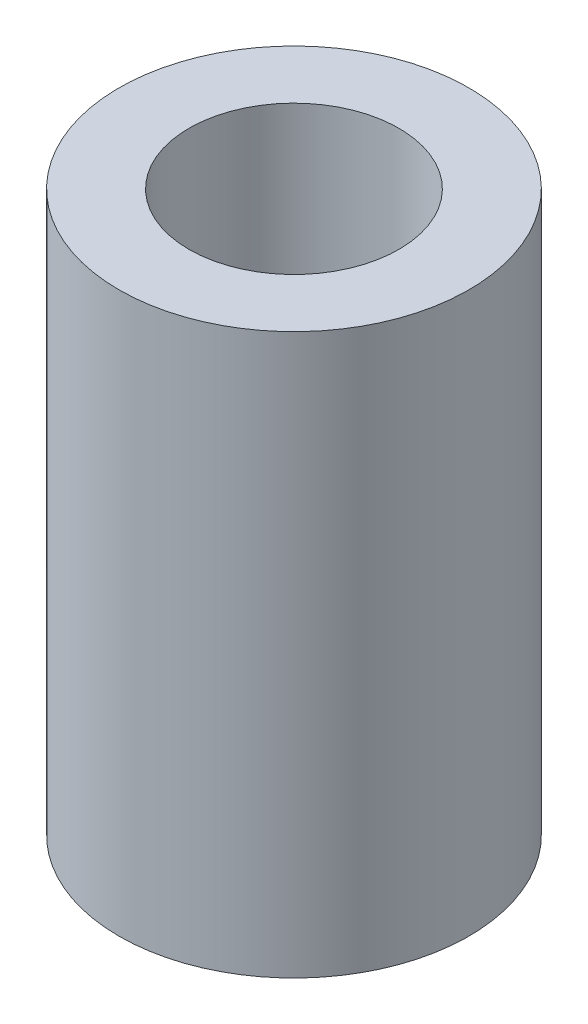
ISO-10303-21;
HEADER;
FILE_DESCRIPTION(('STEP AP214'),'2;1');
FILE_NAME('part.step','',(''),(''),'','','');
FILE_SCHEMA(('AUTOMOTIVE_DESIGN { 1 0 10303 214 1 1 1 1 }'));
ENDSEC;
DATA;
#1=APPLICATION_CONTEXT('core data for automotive mechanical design processes');
#2=APPLICATION_PROTOCOL_DEFINITION('international standard','automotive_design',2000,#1);
#3=PRODUCT_CONTEXT('',#1,'mechanical');
#4=PRODUCT('Part','Part','',(#3));
#5=PRODUCT_RELATED_PRODUCT_CATEGORY('part','',(#4));
#6=PRODUCT_DEFINITION_FORMATION('','',#4);
#7=PRODUCT_DEFINITION_CONTEXT('part definition',#1,'design');
#8=PRODUCT_DEFINITION('design','',#6,#7);
#9=PRODUCT_DEFINITION_SHAPE('','',#8);
#10=(LENGTH_UNIT() NAMED_UNIT(*) SI_UNIT(.MILLI.,.METRE.));
#11=(NAMED_UNIT(*) PLANE_ANGLE_UNIT() SI_UNIT($,.RADIAN.));
#12=(NAMED_UNIT(*) SI_UNIT($,.STERADIAN.) SOLID_ANGLE_UNIT());
#13=UNCERTAINTY_MEASURE_WITH_UNIT(LENGTH_MEASURE(1.E-05),#10,'distance_accuracy_value','');
#14=(GEOMETRIC_REPRESENTATION_CONTEXT(3) GLOBAL_UNCERTAINTY_ASSIGNED_CONTEXT((#13)) GLOBAL_UNIT_ASSIGNED_CONTEXT((#10,
#11,#12)) REPRESENTATION_CONTEXT('',''));
#15=CARTESIAN_POINT('',(0.,0.,0.));
#16=DIRECTION('',(0.,0.,1.));
#17=DIRECTION('',(1.,0.,0.));
#18=AXIS2_PLACEMENT_3D('',#15,#16,#17);
#19=CARTESIAN_POINT('',(0.,8.,0.));
#20=DIRECTION('',(0.,1.,0.));
#21=DIRECTION('',(0.,0.,1.));
#22=AXIS2_PLACEMENT_3D('',#19,#20,#21);
#23=PLANE('',#22);
#24=CARTESIAN_POINT('',(0.,8.,0.));
#25=DIRECTION('',(0.,1.,0.));
#26=DIRECTION('',(0.,0.,1.));
#27=AXIS2_PLACEMENT_3D('',#24,#25,#26);
#28=CIRCLE('',#27,2.5);
#29=CARTESIAN_POINT('',(0.,8.,2.5));
#30=VERTEX_POINT('',#29);
#31=EDGE_CURVE('E10',#30,#30,#28,.T.);
#32=ORIENTED_EDGE('',*,*,#31,.T.);
#33=EDGE_LOOP('',(#32));
#34=FACE_BOUND('',#33,.T.);
#35=CARTESIAN_POINT('',(0.,8.,0.));
#36=DIRECTION('',(0.,1.,0.));
#37=DIRECTION('',(0.,0.,1.));
#38=AXIS2_PLACEMENT_3D('',#35,#36,#37);
#39=CIRCLE('',#38,1.5);
#40=CARTESIAN_POINT('',(0.,8.,1.5));
#41=VERTEX_POINT('',#40);
#42=EDGE_CURVE('E49',#41,#41,#39,.T.);
#43=ORIENTED_EDGE('',*,*,#42,.F.);
#44=EDGE_LOOP('',(#43));
#45=FACE_BOUND('',#44,.T.);
#46=ADVANCED_FACE('F39',(#34,#45),#23,.T.);
#47=CARTESIAN_POINT('',(0.,0.,0.));
#48=DIRECTION('',(0.,1.,0.));
#49=DIRECTION('',(0.,0.,1.));
#50=AXIS2_PLACEMENT_3D('',#47,#48,#49);
#51=PLANE('',#50);
#52=CARTESIAN_POINT('',(0.,0.,0.));
#53=DIRECTION('',(0.,1.,0.));
#54=DIRECTION('',(0.,0.,1.));
#55=AXIS2_PLACEMENT_3D('',#52,#53,#54);
#56=CIRCLE('',#55,2.5);
#57=CARTESIAN_POINT('',(0.,0.,2.5));
#58=VERTEX_POINT('',#57);
#59=EDGE_CURVE('E43',#58,#58,#56,.T.);
#60=ORIENTED_EDGE('',*,*,#59,.F.);
#61=EDGE_LOOP('',(#60));
#62=FACE_BOUND('',#61,.T.);
#63=CARTESIAN_POINT('',(0.,0.,0.));
#64=DIRECTION('',(0.,1.,0.));
#65=DIRECTION('',(0.,0.,1.));
#66=AXIS2_PLACEMENT_3D('',#63,#64,#65);
#67=CIRCLE('',#66,1.5);
#68=CARTESIAN_POINT('',(0.,0.,1.5));
#69=VERTEX_POINT('',#68);
#70=EDGE_CURVE('E55',#69,#69,#67,.T.);
#71=ORIENTED_EDGE('',*,*,#70,.T.);
#72=EDGE_LOOP('',(#71));
#73=FACE_BOUND('',#72,.T.);
#74=ADVANCED_FACE('F62',(#62,#73),#51,.F.);
#75=CARTESIAN_POINT('',(0.,8.,0.));
#76=DIRECTION('',(0.,-1.,0.));
#77=DIRECTION('',(0.,0.,-1.));
#78=AXIS2_PLACEMENT_3D('',#75,#76,#77);
#79=CYLINDRICAL_SURFACE('',#78,2.5);
#80=ORIENTED_EDGE('',*,*,#31,.F.);
#81=EDGE_LOOP('',(#80));
#82=FACE_BOUND('',#81,.T.);
#83=ORIENTED_EDGE('',*,*,#59,.T.);
#84=EDGE_LOOP('',(#83));
#85=FACE_BOUND('',#84,.T.);
#86=ADVANCED_FACE('F41',(#82,#85),#79,.T.);
#87=CARTESIAN_POINT('',(0.,8.,0.));
#88=DIRECTION('',(0.,-1.,0.));
#89=DIRECTION('',(0.,0.,-1.));
#90=AXIS2_PLACEMENT_3D('',#87,#88,#89);
#91=CYLINDRICAL_SURFACE('',#90,1.5);
#92=ORIENTED_EDGE('',*,*,#42,.T.);
#93=EDGE_LOOP('',(#92));
#94=FACE_BOUND('',#93,.T.);
#95=ORIENTED_EDGE('',*,*,#70,.F.);
#96=EDGE_LOOP('',(#95));
#97=FACE_BOUND('',#96,.T.);
#98=ADVANCED_FACE('F59',(#94,#97),#91,.F.);
#99=CLOSED_SHELL('',(#46,#74,#86,#98));
#100=MANIFOLD_SOLID_BREP('B2',#99);
#101=ADVANCED_BREP_SHAPE_REPRESENTATION('',(#18,#100),#14);
#102=SHAPE_DEFINITION_REPRESENTATION(#9,#101);
ENDSEC;
END-ISO-10303-21;
